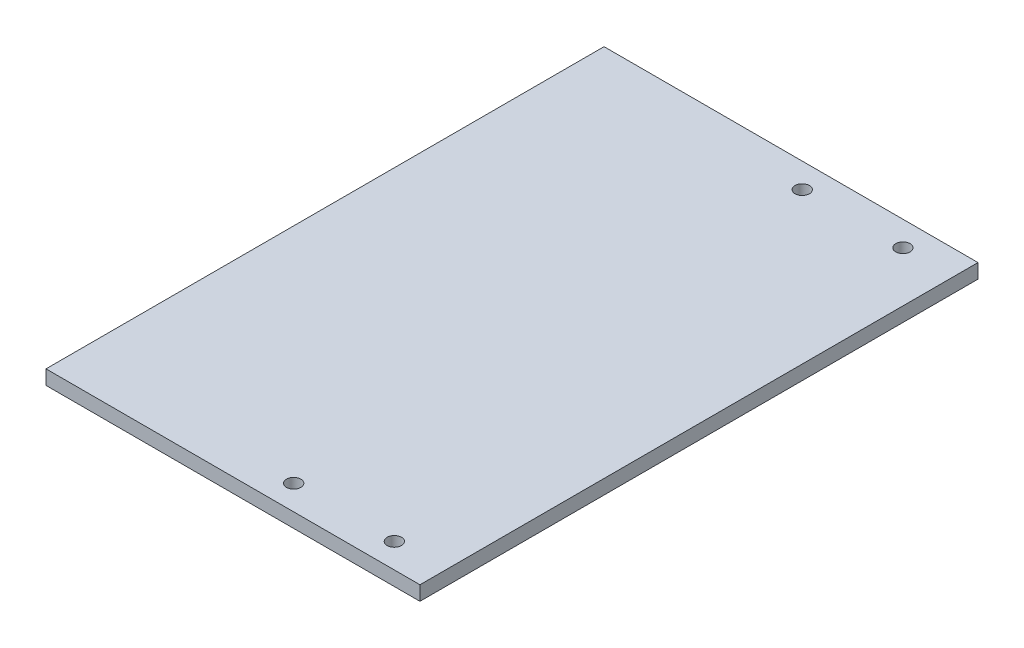
ISO-10303-21;
HEADER;
FILE_DESCRIPTION(('STEP AP214'),'2;1');
FILE_NAME('part.step','',(''),(''),'','','');
FILE_SCHEMA(('AUTOMOTIVE_DESIGN { 1 0 10303 214 1 1 1 1 }'));
ENDSEC;
DATA;
#1=APPLICATION_CONTEXT('core data for automotive mechanical design processes');
#2=APPLICATION_PROTOCOL_DEFINITION('international standard','automotive_design',2000,#1);
#3=PRODUCT_CONTEXT('',#1,'mechanical');
#4=PRODUCT('Part','Part','',(#3));
#5=PRODUCT_RELATED_PRODUCT_CATEGORY('part','',(#4));
#6=PRODUCT_DEFINITION_FORMATION('','',#4);
#7=PRODUCT_DEFINITION_CONTEXT('part definition',#1,'design');
#8=PRODUCT_DEFINITION('design','',#6,#7);
#9=PRODUCT_DEFINITION_SHAPE('','',#8);
#10=(LENGTH_UNIT() NAMED_UNIT(*) SI_UNIT(.MILLI.,.METRE.));
#11=(NAMED_UNIT(*) PLANE_ANGLE_UNIT() SI_UNIT($,.RADIAN.));
#12=(NAMED_UNIT(*) SI_UNIT($,.STERADIAN.) SOLID_ANGLE_UNIT());
#13=UNCERTAINTY_MEASURE_WITH_UNIT(LENGTH_MEASURE(1.E-05),#10,'distance_accuracy_value','');
#14=(GEOMETRIC_REPRESENTATION_CONTEXT(3) GLOBAL_UNCERTAINTY_ASSIGNED_CONTEXT((#13)) GLOBAL_UNIT_ASSIGNED_CONTEXT((#10,
#11,#12)) REPRESENTATION_CONTEXT('',''));
#15=CARTESIAN_POINT('',(0.,0.,0.));
#16=DIRECTION('',(0.,0.,1.));
#17=DIRECTION('',(1.,0.,0.));
#18=AXIS2_PLACEMENT_3D('',#15,#16,#17);
#19=CARTESIAN_POINT('',(0.,5.,0.));
#20=DIRECTION('',(0.,1.,0.));
#21=DIRECTION('',(0.,0.,1.));
#22=AXIS2_PLACEMENT_3D('',#19,#20,#21);
#23=PLANE('',#22);
#24=CARTESIAN_POINT('',(112.5,5.,185.400849456493));
#25=DIRECTION('',(0.,1.,0.));
#26=DIRECTION('',(0.,0.,1.));
#27=AXIS2_PLACEMENT_3D('',#24,#25,#26);
#28=CIRCLE('',#27,2.5);
#29=CARTESIAN_POINT('',(112.5,5.,187.900849456493));
#30=VERTEX_POINT('',#29);
#31=EDGE_CURVE('E121',#30,#30,#28,.T.);
#32=ORIENTED_EDGE('',*,*,#31,.F.);
#33=EDGE_LOOP('',(#32));
#34=FACE_BOUND('',#33,.T.);
#35=CARTESIAN_POINT('',(77.5000000000001,5.,8.59915054350716));
#36=DIRECTION('',(0.,1.,0.));
#37=DIRECTION('',(0.,0.,1.));
#38=AXIS2_PLACEMENT_3D('',#35,#36,#37);
#39=CIRCLE('',#38,2.5);
#40=CARTESIAN_POINT('',(77.5000000000001,5.,11.0991505435072));
#41=VERTEX_POINT('',#40);
#42=EDGE_CURVE('E100',#41,#41,#39,.T.);
#43=ORIENTED_EDGE('',*,*,#42,.F.);
#44=EDGE_LOOP('',(#43));
#45=FACE_BOUND('',#44,.T.);
#46=DIRECTION('',(0.,0.,1.));
#47=VECTOR('',#46,1.);
#48=CARTESIAN_POINT('',(0.,5.,0.));
#49=LINE('',#48,#47);
#50=CARTESIAN_POINT('',(0.,5.,0.));
#51=VERTEX_POINT('',#50);
#52=CARTESIAN_POINT('',(0.,5.,194.));
#53=VERTEX_POINT('',#52);
#54=EDGE_CURVE('E85',#51,#53,#49,.T.);
#55=ORIENTED_EDGE('',*,*,#54,.T.);
#56=DIRECTION('',(1.,0.,0.));
#57=VECTOR('',#56,1.);
#58=CARTESIAN_POINT('',(0.,5.,194.));
#59=LINE('',#58,#57);
#60=CARTESIAN_POINT('',(130.,5.,194.));
#61=VERTEX_POINT('',#60);
#62=EDGE_CURVE('E80',#53,#61,#59,.T.);
#63=ORIENTED_EDGE('',*,*,#62,.T.);
#64=DIRECTION('',(0.,0.,-1.));
#65=VECTOR('',#64,1.);
#66=CARTESIAN_POINT('',(130.,5.,0.));
#67=LINE('',#66,#65);
#68=CARTESIAN_POINT('',(130.,5.,0.));
#69=VERTEX_POINT('',#68);
#70=EDGE_CURVE('E83',#61,#69,#67,.T.);
#71=ORIENTED_EDGE('',*,*,#70,.T.);
#72=DIRECTION('',(-1.,0.,0.));
#73=VECTOR('',#72,1.);
#74=CARTESIAN_POINT('',(0.,5.,0.));
#75=LINE('',#74,#73);
#76=EDGE_CURVE('E50',#69,#51,#75,.T.);
#77=ORIENTED_EDGE('',*,*,#76,.T.);
#78=EDGE_LOOP('',(#55,#63,#71,#77));
#79=FACE_BOUND('',#78,.T.);
#80=CARTESIAN_POINT('',(112.5,5.,8.59915054350716));
#81=DIRECTION('',(0.,1.,0.));
#82=DIRECTION('',(0.,0.,-1.));
#83=AXIS2_PLACEMENT_3D('',#80,#81,#82);
#84=CIRCLE('',#83,2.5);
#85=CARTESIAN_POINT('',(112.5,5.,6.09915054350716));
#86=VERTEX_POINT('',#85);
#87=EDGE_CURVE('E115',#86,#86,#84,.T.);
#88=ORIENTED_EDGE('',*,*,#87,.F.);
#89=EDGE_LOOP('',(#88));
#90=FACE_BOUND('',#89,.T.);
#91=CARTESIAN_POINT('',(77.5000000000001,5.,185.400849456493));
#92=DIRECTION('',(0.,1.,0.));
#93=DIRECTION('',(0.,0.,-1.));
#94=AXIS2_PLACEMENT_3D('',#91,#92,#93);
#95=CIRCLE('',#94,2.5);
#96=CARTESIAN_POINT('',(77.5000000000001,5.,182.900849456493));
#97=VERTEX_POINT('',#96);
#98=EDGE_CURVE('E127',#97,#97,#95,.T.);
#99=ORIENTED_EDGE('',*,*,#98,.F.);
#100=EDGE_LOOP('',(#99));
#101=FACE_BOUND('',#100,.T.);
#102=ADVANCED_FACE('F33',(#34,#45,#79,#90,#101),#23,.T.);
#103=CARTESIAN_POINT('',(0.,0.,0.));
#104=DIRECTION('',(0.,1.,0.));
#105=DIRECTION('',(0.,0.,1.));
#106=AXIS2_PLACEMENT_3D('',#103,#104,#105);
#107=PLANE('',#106);
#108=DIRECTION('',(0.,0.,1.));
#109=VECTOR('',#108,1.);
#110=CARTESIAN_POINT('',(0.,0.,0.));
#111=LINE('',#110,#109);
#112=CARTESIAN_POINT('',(0.,0.,0.));
#113=VERTEX_POINT('',#112);
#114=CARTESIAN_POINT('',(0.,0.,194.));
#115=VERTEX_POINT('',#114);
#116=EDGE_CURVE('E97',#113,#115,#111,.T.);
#117=ORIENTED_EDGE('',*,*,#116,.F.);
#118=DIRECTION('',(-1.,0.,0.));
#119=VECTOR('',#118,1.);
#120=CARTESIAN_POINT('',(0.,0.,0.));
#121=LINE('',#120,#119);
#122=CARTESIAN_POINT('',(130.,0.,0.));
#123=VERTEX_POINT('',#122);
#124=EDGE_CURVE('E73',#123,#113,#121,.T.);
#125=ORIENTED_EDGE('',*,*,#124,.F.);
#126=DIRECTION('',(0.,0.,-1.));
#127=VECTOR('',#126,1.);
#128=CARTESIAN_POINT('',(130.,0.,0.));
#129=LINE('',#128,#127);
#130=CARTESIAN_POINT('',(130.,0.,194.));
#131=VERTEX_POINT('',#130);
#132=EDGE_CURVE('E67',#131,#123,#129,.T.);
#133=ORIENTED_EDGE('',*,*,#132,.F.);
#134=DIRECTION('',(1.,0.,0.));
#135=VECTOR('',#134,1.);
#136=CARTESIAN_POINT('',(0.,0.,194.));
#137=LINE('',#136,#135);
#138=EDGE_CURVE('E89',#115,#131,#137,.T.);
#139=ORIENTED_EDGE('',*,*,#138,.F.);
#140=EDGE_LOOP('',(#117,#125,#133,#139));
#141=FACE_BOUND('',#140,.T.);
#142=CARTESIAN_POINT('',(77.5000000000001,0.,8.59915054350716));
#143=DIRECTION('',(0.,1.,0.));
#144=DIRECTION('',(0.,0.,1.));
#145=AXIS2_PLACEMENT_3D('',#142,#143,#144);
#146=CIRCLE('',#145,2.5);
#147=CARTESIAN_POINT('',(77.5000000000001,0.,11.0991505435072));
#148=VERTEX_POINT('',#147);
#149=EDGE_CURVE('E112',#148,#148,#146,.T.);
#150=ORIENTED_EDGE('',*,*,#149,.T.);
#151=EDGE_LOOP('',(#150));
#152=FACE_BOUND('',#151,.T.);
#153=CARTESIAN_POINT('',(112.5,0.,8.59915054350716));
#154=DIRECTION('',(0.,1.,0.));
#155=DIRECTION('',(0.,0.,-1.));
#156=AXIS2_PLACEMENT_3D('',#153,#154,#155);
#157=CIRCLE('',#156,2.5);
#158=CARTESIAN_POINT('',(112.5,0.,6.09915054350716));
#159=VERTEX_POINT('',#158);
#160=EDGE_CURVE('E118',#159,#159,#157,.T.);
#161=ORIENTED_EDGE('',*,*,#160,.T.);
#162=EDGE_LOOP('',(#161));
#163=FACE_BOUND('',#162,.T.);
#164=CARTESIAN_POINT('',(112.5,0.,185.400849456493));
#165=DIRECTION('',(0.,1.,0.));
#166=DIRECTION('',(0.,0.,1.));
#167=AXIS2_PLACEMENT_3D('',#164,#165,#166);
#168=CIRCLE('',#167,2.5);
#169=CARTESIAN_POINT('',(112.5,0.,187.900849456493));
#170=VERTEX_POINT('',#169);
#171=EDGE_CURVE('E124',#170,#170,#168,.T.);
#172=ORIENTED_EDGE('',*,*,#171,.T.);
#173=EDGE_LOOP('',(#172));
#174=FACE_BOUND('',#173,.T.);
#175=CARTESIAN_POINT('',(77.5000000000001,0.,185.400849456493));
#176=DIRECTION('',(0.,1.,0.));
#177=DIRECTION('',(0.,0.,-1.));
#178=AXIS2_PLACEMENT_3D('',#175,#176,#177);
#179=CIRCLE('',#178,2.5);
#180=CARTESIAN_POINT('',(77.5000000000001,0.,182.900849456493));
#181=VERTEX_POINT('',#180);
#182=EDGE_CURVE('E130',#181,#181,#179,.T.);
#183=ORIENTED_EDGE('',*,*,#182,.T.);
#184=EDGE_LOOP('',(#183));
#185=FACE_BOUND('',#184,.T.);
#186=ADVANCED_FACE('F108',(#141,#152,#163,#174,#185),#107,.F.);
#187=CARTESIAN_POINT('',(0.,5.,0.));
#188=DIRECTION('',(1.,0.,0.));
#189=DIRECTION('',(0.,0.,-1.));
#190=AXIS2_PLACEMENT_3D('',#187,#188,#189);
#191=PLANE('',#190);
#192=ORIENTED_EDGE('',*,*,#116,.T.);
#193=DIRECTION('',(0.,-1.,0.));
#194=VECTOR('',#193,1.);
#195=CARTESIAN_POINT('',(0.,5.,194.));
#196=LINE('',#195,#194);
#197=EDGE_CURVE('E11',#53,#115,#196,.T.);
#198=ORIENTED_EDGE('',*,*,#197,.F.);
#199=ORIENTED_EDGE('',*,*,#54,.F.);
#200=DIRECTION('',(0.,-1.,0.));
#201=VECTOR('',#200,1.);
#202=CARTESIAN_POINT('',(0.,5.,0.));
#203=LINE('',#202,#201);
#204=EDGE_CURVE('E93',#51,#113,#203,.T.);
#205=ORIENTED_EDGE('',*,*,#204,.T.);
#206=EDGE_LOOP('',(#192,#198,#199,#205));
#207=FACE_BOUND('',#206,.T.);
#208=ADVANCED_FACE('F35',(#207),#191,.F.);
#209=CARTESIAN_POINT('',(0.,5.,194.));
#210=DIRECTION('',(0.,0.,-1.));
#211=DIRECTION('',(-1.,0.,0.));
#212=AXIS2_PLACEMENT_3D('',#209,#210,#211);
#213=PLANE('',#212);
#214=ORIENTED_EDGE('',*,*,#138,.T.);
#215=DIRECTION('',(0.,-1.,0.));
#216=VECTOR('',#215,1.);
#217=CARTESIAN_POINT('',(130.,5.,194.));
#218=LINE('',#217,#216);
#219=EDGE_CURVE('E42',#61,#131,#218,.T.);
#220=ORIENTED_EDGE('',*,*,#219,.F.);
#221=ORIENTED_EDGE('',*,*,#62,.F.);
#222=ORIENTED_EDGE('',*,*,#197,.T.);
#223=EDGE_LOOP('',(#214,#220,#221,#222));
#224=FACE_BOUND('',#223,.T.);
#225=ADVANCED_FACE('F88',(#224),#213,.F.);
#226=CARTESIAN_POINT('',(130.,5.,0.));
#227=DIRECTION('',(-1.,0.,0.));
#228=DIRECTION('',(0.,0.,1.));
#229=AXIS2_PLACEMENT_3D('',#226,#227,#228);
#230=PLANE('',#229);
#231=ORIENTED_EDGE('',*,*,#132,.T.);
#232=DIRECTION('',(0.,-1.,0.));
#233=VECTOR('',#232,1.);
#234=CARTESIAN_POINT('',(130.,5.,0.));
#235=LINE('',#234,#233);
#236=EDGE_CURVE('E90',#69,#123,#235,.T.);
#237=ORIENTED_EDGE('',*,*,#236,.F.);
#238=ORIENTED_EDGE('',*,*,#70,.F.);
#239=ORIENTED_EDGE('',*,*,#219,.T.);
#240=EDGE_LOOP('',(#231,#237,#238,#239));
#241=FACE_BOUND('',#240,.T.);
#242=ADVANCED_FACE('F91',(#241),#230,.F.);
#243=CARTESIAN_POINT('',(0.,5.,0.));
#244=DIRECTION('',(0.,0.,1.));
#245=DIRECTION('',(1.,0.,0.));
#246=AXIS2_PLACEMENT_3D('',#243,#244,#245);
#247=PLANE('',#246);
#248=ORIENTED_EDGE('',*,*,#124,.T.);
#249=ORIENTED_EDGE('',*,*,#204,.F.);
#250=ORIENTED_EDGE('',*,*,#76,.F.);
#251=ORIENTED_EDGE('',*,*,#236,.T.);
#252=EDGE_LOOP('',(#248,#249,#250,#251));
#253=FACE_BOUND('',#252,.T.);
#254=ADVANCED_FACE('F105',(#253),#247,.F.);
#255=CARTESIAN_POINT('',(77.5000000000001,5.,8.59915054350716));
#256=DIRECTION('',(0.,-1.,0.));
#257=DIRECTION('',(0.,0.,-1.));
#258=AXIS2_PLACEMENT_3D('',#255,#256,#257);
#259=CYLINDRICAL_SURFACE('',#258,2.5);
#260=ORIENTED_EDGE('',*,*,#42,.T.);
#261=EDGE_LOOP('',(#260));
#262=FACE_BOUND('',#261,.T.);
#263=ORIENTED_EDGE('',*,*,#149,.F.);
#264=EDGE_LOOP('',(#263));
#265=FACE_BOUND('',#264,.T.);
#266=ADVANCED_FACE('F149',(#262,#265),#259,.F.);
#267=CARTESIAN_POINT('',(112.5,5.,8.59915054350716));
#268=DIRECTION('',(0.,-1.,0.));
#269=DIRECTION('',(0.,0.,-1.));
#270=AXIS2_PLACEMENT_3D('',#267,#268,#269);
#271=CYLINDRICAL_SURFACE('',#270,2.5);
#272=ORIENTED_EDGE('',*,*,#87,.T.);
#273=EDGE_LOOP('',(#272));
#274=FACE_BOUND('',#273,.T.);
#275=ORIENTED_EDGE('',*,*,#160,.F.);
#276=EDGE_LOOP('',(#275));
#277=FACE_BOUND('',#276,.T.);
#278=ADVANCED_FACE('F195',(#274,#277),#271,.F.);
#279=CARTESIAN_POINT('',(112.5,5.,185.400849456493));
#280=DIRECTION('',(0.,-1.,0.));
#281=DIRECTION('',(0.,0.,-1.));
#282=AXIS2_PLACEMENT_3D('',#279,#280,#281);
#283=CYLINDRICAL_SURFACE('',#282,2.5);
#284=ORIENTED_EDGE('',*,*,#31,.T.);
#285=EDGE_LOOP('',(#284));
#286=FACE_BOUND('',#285,.T.);
#287=ORIENTED_EDGE('',*,*,#171,.F.);
#288=EDGE_LOOP('',(#287));
#289=FACE_BOUND('',#288,.T.);
#290=ADVANCED_FACE('F203',(#286,#289),#283,.F.);
#291=CARTESIAN_POINT('',(77.5000000000001,5.,185.400849456493));
#292=DIRECTION('',(0.,-1.,0.));
#293=DIRECTION('',(0.,0.,-1.));
#294=AXIS2_PLACEMENT_3D('',#291,#292,#293);
#295=CYLINDRICAL_SURFACE('',#294,2.5);
#296=ORIENTED_EDGE('',*,*,#98,.T.);
#297=EDGE_LOOP('',(#296));
#298=FACE_BOUND('',#297,.T.);
#299=ORIENTED_EDGE('',*,*,#182,.F.);
#300=EDGE_LOOP('',(#299));
#301=FACE_BOUND('',#300,.T.);
#302=ADVANCED_FACE('F136',(#298,#301),#295,.F.);
#303=CLOSED_SHELL('',(#102,#186,#208,#225,#242,#254,#266,#278,#290,#302));
#304=MANIFOLD_SOLID_BREP('B2',#303);
#305=ADVANCED_BREP_SHAPE_REPRESENTATION('',(#18,#304),#14);
#306=SHAPE_DEFINITION_REPRESENTATION(#9,#305);
ENDSEC;
END-ISO-10303-21;
